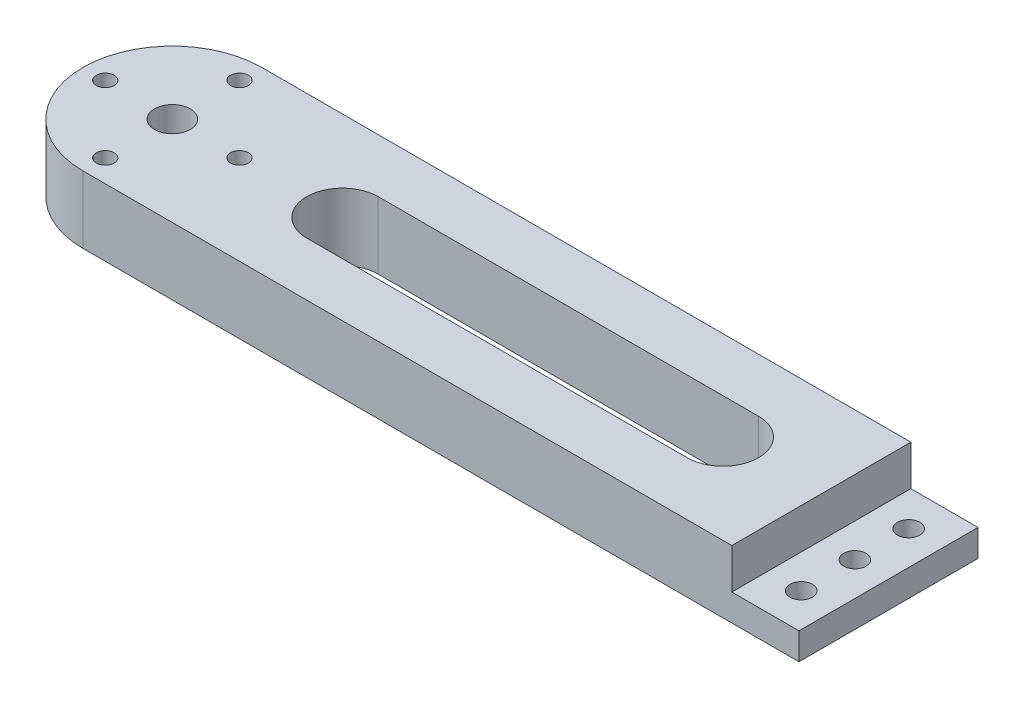
ISO-10303-21;
HEADER;
FILE_DESCRIPTION(('STEP AP214'),'2;1');
FILE_NAME('part.step','',(''),(''),'','','');
FILE_SCHEMA(('AUTOMOTIVE_DESIGN { 1 0 10303 214 1 1 1 1 }'));
ENDSEC;
DATA;
#1=APPLICATION_CONTEXT('core data for automotive mechanical design processes');
#2=APPLICATION_PROTOCOL_DEFINITION('international standard','automotive_design',2000,#1);
#3=PRODUCT_CONTEXT('',#1,'mechanical');
#4=PRODUCT('Part','Part','',(#3));
#5=PRODUCT_RELATED_PRODUCT_CATEGORY('part','',(#4));
#6=PRODUCT_DEFINITION_FORMATION('','',#4);
#7=PRODUCT_DEFINITION_CONTEXT('part definition',#1,'design');
#8=PRODUCT_DEFINITION('design','',#6,#7);
#9=PRODUCT_DEFINITION_SHAPE('','',#8);
#10=(LENGTH_UNIT() NAMED_UNIT(*) SI_UNIT(.MILLI.,.METRE.));
#11=(NAMED_UNIT(*) PLANE_ANGLE_UNIT() SI_UNIT($,.RADIAN.));
#12=(NAMED_UNIT(*) SI_UNIT($,.STERADIAN.) SOLID_ANGLE_UNIT());
#13=UNCERTAINTY_MEASURE_WITH_UNIT(LENGTH_MEASURE(1.E-05),#10,'distance_accuracy_value','');
#14=(GEOMETRIC_REPRESENTATION_CONTEXT(3) GLOBAL_UNCERTAINTY_ASSIGNED_CONTEXT((#13)) GLOBAL_UNIT_ASSIGNED_CONTEXT((#10,
#11,#12)) REPRESENTATION_CONTEXT('',''));
#15=CARTESIAN_POINT('',(0.,0.,0.));
#16=DIRECTION('',(0.,0.,1.));
#17=DIRECTION('',(1.,0.,0.));
#18=AXIS2_PLACEMENT_3D('',#15,#16,#17);
#19=CARTESIAN_POINT('',(0.,15.,0.));
#20=DIRECTION('',(0.,1.,0.));
#21=DIRECTION('',(0.,0.,1.));
#22=AXIS2_PLACEMENT_3D('',#19,#20,#21);
#23=PLANE('',#22);
#24=DIRECTION('',(0.,0.,1.));
#25=VECTOR('',#24,1.);
#26=CARTESIAN_POINT('',(145.,15.,-20.001));
#27=LINE('',#26,#25);
#28=CARTESIAN_POINT('',(145.,15.,-20.));
#29=VERTEX_POINT('',#28);
#30=CARTESIAN_POINT('',(145.,15.,20.));
#31=VERTEX_POINT('',#30);
#32=EDGE_CURVE('E171',#29,#31,#27,.T.);
#33=ORIENTED_EDGE('',*,*,#32,.F.);
#34=DIRECTION('',(-1.,0.,0.));
#35=VECTOR('',#34,1.);
#36=CARTESIAN_POINT('',(0.,15.,-20.));
#37=LINE('',#36,#35);
#38=CARTESIAN_POINT('',(0.,15.,-20.));
#39=VERTEX_POINT('',#38);
#40=EDGE_CURVE('E216',#29,#39,#37,.T.);
#41=ORIENTED_EDGE('',*,*,#40,.T.);
#42=CARTESIAN_POINT('',(0.,15.,0.));
#43=DIRECTION('',(0.,1.,0.));
#44=DIRECTION('',(0.,0.,1.));
#45=AXIS2_PLACEMENT_3D('',#42,#43,#44);
#46=CIRCLE('',#45,20.);
#47=CARTESIAN_POINT('',(0.,15.,20.));
#48=VERTEX_POINT('',#47);
#49=EDGE_CURVE('E209',#39,#48,#46,.T.);
#50=ORIENTED_EDGE('',*,*,#49,.T.);
#51=DIRECTION('',(1.,0.,0.));
#52=VECTOR('',#51,1.);
#53=CARTESIAN_POINT('',(0.,15.,20.));
#54=LINE('',#53,#52);
#55=EDGE_CURVE('E212',#48,#31,#54,.T.);
#56=ORIENTED_EDGE('',*,*,#55,.T.);
#57=EDGE_LOOP('',(#33,#41,#50,#56));
#58=FACE_BOUND('',#57,.T.);
#59=CARTESIAN_POINT('',(1.68570821703788E-12,15.,15.));
#60=DIRECTION('',(0.,1.,0.));
#61=DIRECTION('',(0.,0.,1.));
#62=AXIS2_PLACEMENT_3D('',#59,#60,#61);
#63=CIRCLE('',#62,2.);
#64=CARTESIAN_POINT('',(1.68570821703788E-12,15.,17.));
#65=VERTEX_POINT('',#64);
#66=EDGE_CURVE('E185',#65,#65,#63,.T.);
#67=ORIENTED_EDGE('',*,*,#66,.F.);
#68=EDGE_LOOP('',(#67));
#69=FACE_BOUND('',#68,.T.);
#70=CARTESIAN_POINT('',(0.,15.,-15.));
#71=DIRECTION('',(0.,1.,0.));
#72=DIRECTION('',(0.,0.,1.));
#73=AXIS2_PLACEMENT_3D('',#70,#71,#72);
#74=CIRCLE('',#73,2.);
#75=CARTESIAN_POINT('',(0.,15.,-13.));
#76=VERTEX_POINT('',#75);
#77=EDGE_CURVE('E197',#76,#76,#74,.T.);
#78=ORIENTED_EDGE('',*,*,#77,.F.);
#79=EDGE_LOOP('',(#78));
#80=FACE_BOUND('',#79,.T.);
#81=CARTESIAN_POINT('',(0.,15.,0.));
#82=DIRECTION('',(0.,1.,0.));
#83=DIRECTION('',(0.,0.,1.));
#84=AXIS2_PLACEMENT_3D('',#81,#82,#83);
#85=CIRCLE('',#84,4.);
#86=CARTESIAN_POINT('',(0.,15.,4.));
#87=VERTEX_POINT('',#86);
#88=EDGE_CURVE('E203',#87,#87,#85,.T.);
#89=ORIENTED_EDGE('',*,*,#88,.F.);
#90=EDGE_LOOP('',(#89));
#91=FACE_BOUND('',#90,.T.);
#92=CARTESIAN_POINT('',(15.0000000000008,15.,-8.46221887216597E-13));
#93=DIRECTION('',(0.,1.,0.));
#94=DIRECTION('',(0.,0.,1.));
#95=AXIS2_PLACEMENT_3D('',#92,#93,#94);
#96=CIRCLE('',#95,2.);
#97=CARTESIAN_POINT('',(15.0000000000008,15.,1.99999999999915));
#98=VERTEX_POINT('',#97);
#99=EDGE_CURVE('E191',#98,#98,#96,.T.);
#100=ORIENTED_EDGE('',*,*,#99,.F.);
#101=EDGE_LOOP('',(#100));
#102=FACE_BOUND('',#101,.T.);
#103=CARTESIAN_POINT('',(-14.9999999999992,15.,8.48058857415317E-13));
#104=DIRECTION('',(0.,1.,0.));
#105=DIRECTION('',(0.,0.,1.));
#106=AXIS2_PLACEMENT_3D('',#103,#104,#105);
#107=CIRCLE('',#106,2.);
#108=CARTESIAN_POINT('',(-14.9999999999992,15.,2.00000000000084));
#109=VERTEX_POINT('',#108);
#110=EDGE_CURVE('E179',#109,#109,#107,.T.);
#111=ORIENTED_EDGE('',*,*,#110,.F.);
#112=EDGE_LOOP('',(#111));
#113=FACE_BOUND('',#112,.T.);
#114=DIRECTION('',(-1.,0.,0.));
#115=VECTOR('',#114,1.);
#116=CARTESIAN_POINT('',(38.,15.,-7.99999999999998));
#117=LINE('',#116,#115);
#118=CARTESIAN_POINT('',(123.,15.,-8.00000000000002));
#119=VERTEX_POINT('',#118);
#120=CARTESIAN_POINT('',(38.,15.,-7.99999999999998));
#121=VERTEX_POINT('',#120);
#122=EDGE_CURVE('E128',#119,#121,#117,.T.);
#123=ORIENTED_EDGE('',*,*,#122,.F.);
#124=CARTESIAN_POINT('',(123.,15.,0.));
#125=DIRECTION('',(0.,1.,0.));
#126=DIRECTION('',(0.,0.,1.));
#127=AXIS2_PLACEMENT_3D('',#124,#125,#126);
#128=CIRCLE('',#127,8.);
#129=CARTESIAN_POINT('',(123.,15.,7.99999999999998));
#130=VERTEX_POINT('',#129);
#131=EDGE_CURVE('E112',#130,#119,#128,.T.);
#132=ORIENTED_EDGE('',*,*,#131,.F.);
#133=DIRECTION('',(1.,0.,0.));
#134=VECTOR('',#133,1.);
#135=CARTESIAN_POINT('',(38.,15.,7.99999999999998));
#136=LINE('',#135,#134);
#137=CARTESIAN_POINT('',(38.,15.,7.99999999999998));
#138=VERTEX_POINT('',#137);
#139=EDGE_CURVE('E121',#138,#130,#136,.T.);
#140=ORIENTED_EDGE('',*,*,#139,.F.);
#141=CARTESIAN_POINT('',(38.,15.,0.));
#142=DIRECTION('',(0.,1.,0.));
#143=DIRECTION('',(0.,0.,1.));
#144=AXIS2_PLACEMENT_3D('',#141,#142,#143);
#145=CIRCLE('',#144,7.99999999999998);
#146=EDGE_CURVE('E48',#121,#138,#145,.T.);
#147=ORIENTED_EDGE('',*,*,#146,.F.);
#148=EDGE_LOOP('',(#123,#132,#140,#147));
#149=FACE_BOUND('',#148,.T.);
#150=ADVANCED_FACE('F33',(#58,#69,#80,#91,#102,#113,#149),#23,.T.);
#151=CARTESIAN_POINT('',(0.,0.,0.));
#152=DIRECTION('',(0.,1.,0.));
#153=DIRECTION('',(0.,0.,1.));
#154=AXIS2_PLACEMENT_3D('',#151,#152,#153);
#155=PLANE('',#154);
#156=CARTESIAN_POINT('',(-14.9999999999992,0.,8.48058857415317E-13));
#157=DIRECTION('',(0.,1.,0.));
#158=DIRECTION('',(0.,0.,1.));
#159=AXIS2_PLACEMENT_3D('',#156,#157,#158);
#160=CIRCLE('',#159,2.);
#161=CARTESIAN_POINT('',(-14.9999999999992,0.,2.00000000000084));
#162=VERTEX_POINT('',#161);
#163=EDGE_CURVE('E175',#162,#162,#160,.T.);
#164=ORIENTED_EDGE('',*,*,#163,.T.);
#165=EDGE_LOOP('',(#164));
#166=FACE_BOUND('',#165,.T.);
#167=CARTESIAN_POINT('',(1.68570821703788E-12,0.,15.));
#168=DIRECTION('',(0.,1.,0.));
#169=DIRECTION('',(0.,0.,1.));
#170=AXIS2_PLACEMENT_3D('',#167,#168,#169);
#171=CIRCLE('',#170,2.);
#172=CARTESIAN_POINT('',(1.68570821703788E-12,0.,17.));
#173=VERTEX_POINT('',#172);
#174=EDGE_CURVE('E182',#173,#173,#171,.T.);
#175=ORIENTED_EDGE('',*,*,#174,.T.);
#176=EDGE_LOOP('',(#175));
#177=FACE_BOUND('',#176,.T.);
#178=CARTESIAN_POINT('',(15.0000000000008,0.,-8.46221887216597E-13));
#179=DIRECTION('',(0.,1.,0.));
#180=DIRECTION('',(0.,0.,1.));
#181=AXIS2_PLACEMENT_3D('',#178,#179,#180);
#182=CIRCLE('',#181,2.);
#183=CARTESIAN_POINT('',(15.0000000000008,0.,1.99999999999915));
#184=VERTEX_POINT('',#183);
#185=EDGE_CURVE('E188',#184,#184,#182,.T.);
#186=ORIENTED_EDGE('',*,*,#185,.T.);
#187=EDGE_LOOP('',(#186));
#188=FACE_BOUND('',#187,.T.);
#189=CARTESIAN_POINT('',(0.,0.,-15.));
#190=DIRECTION('',(0.,1.,0.));
#191=DIRECTION('',(0.,0.,1.));
#192=AXIS2_PLACEMENT_3D('',#189,#190,#191);
#193=CIRCLE('',#192,2.);
#194=CARTESIAN_POINT('',(0.,0.,-13.));
#195=VERTEX_POINT('',#194);
#196=EDGE_CURVE('E194',#195,#195,#193,.T.);
#197=ORIENTED_EDGE('',*,*,#196,.T.);
#198=EDGE_LOOP('',(#197));
#199=FACE_BOUND('',#198,.T.);
#200=CARTESIAN_POINT('',(0.,0.,0.));
#201=DIRECTION('',(0.,1.,0.));
#202=DIRECTION('',(0.,0.,1.));
#203=AXIS2_PLACEMENT_3D('',#200,#201,#202);
#204=CIRCLE('',#203,4.);
#205=CARTESIAN_POINT('',(0.,0.,4.));
#206=VERTEX_POINT('',#205);
#207=EDGE_CURVE('E200',#206,#206,#204,.T.);
#208=ORIENTED_EDGE('',*,*,#207,.T.);
#209=EDGE_LOOP('',(#208));
#210=FACE_BOUND('',#209,.T.);
#211=CARTESIAN_POINT('',(0.,0.,0.));
#212=DIRECTION('',(0.,1.,0.));
#213=DIRECTION('',(0.,0.,1.));
#214=AXIS2_PLACEMENT_3D('',#211,#212,#213);
#215=CIRCLE('',#214,20.);
#216=CARTESIAN_POINT('',(0.,0.,-20.));
#217=VERTEX_POINT('',#216);
#218=CARTESIAN_POINT('',(0.,0.,20.));
#219=VERTEX_POINT('',#218);
#220=EDGE_CURVE('E206',#217,#219,#215,.T.);
#221=ORIENTED_EDGE('',*,*,#220,.F.);
#222=DIRECTION('',(-1.,0.,0.));
#223=VECTOR('',#222,1.);
#224=CARTESIAN_POINT('',(0.,0.,-20.));
#225=LINE('',#224,#223);
#226=CARTESIAN_POINT('',(160.,0.,-20.));
#227=VERTEX_POINT('',#226);
#228=EDGE_CURVE('E213',#227,#217,#225,.T.);
#229=ORIENTED_EDGE('',*,*,#228,.F.);
#230=DIRECTION('',(0.,0.,-1.));
#231=VECTOR('',#230,1.);
#232=CARTESIAN_POINT('',(160.,0.,-20.));
#233=LINE('',#232,#231);
#234=CARTESIAN_POINT('',(160.,0.,20.));
#235=VERTEX_POINT('',#234);
#236=EDGE_CURVE('E224',#235,#227,#233,.T.);
#237=ORIENTED_EDGE('',*,*,#236,.F.);
#238=DIRECTION('',(1.,0.,0.));
#239=VECTOR('',#238,1.);
#240=CARTESIAN_POINT('',(0.,0.,20.));
#241=LINE('',#240,#239);
#242=EDGE_CURVE('E221',#219,#235,#241,.T.);
#243=ORIENTED_EDGE('',*,*,#242,.F.);
#244=EDGE_LOOP('',(#221,#229,#237,#243));
#245=FACE_BOUND('',#244,.T.);
#246=CARTESIAN_POINT('',(152.5,0.,-12.));
#247=DIRECTION('',(0.,-1.,0.));
#248=DIRECTION('',(0.,0.,-1.));
#249=AXIS2_PLACEMENT_3D('',#246,#247,#248);
#250=CIRCLE('',#249,2.5);
#251=CARTESIAN_POINT('',(152.5,0.,-14.5));
#252=VERTEX_POINT('',#251);
#253=EDGE_CURVE('E156',#252,#252,#250,.T.);
#254=ORIENTED_EDGE('',*,*,#253,.F.);
#255=EDGE_LOOP('',(#254));
#256=FACE_BOUND('',#255,.T.);
#257=CARTESIAN_POINT('',(152.5,0.,0.));
#258=DIRECTION('',(0.,-1.,0.));
#259=DIRECTION('',(0.,0.,-1.));
#260=AXIS2_PLACEMENT_3D('',#257,#258,#259);
#261=CIRCLE('',#260,2.5);
#262=CARTESIAN_POINT('',(152.5,0.,-2.5));
#263=VERTEX_POINT('',#262);
#264=EDGE_CURVE('E150',#263,#263,#261,.T.);
#265=ORIENTED_EDGE('',*,*,#264,.F.);
#266=EDGE_LOOP('',(#265));
#267=FACE_BOUND('',#266,.T.);
#268=CARTESIAN_POINT('',(152.5,0.,12.));
#269=DIRECTION('',(0.,-1.,0.));
#270=DIRECTION('',(0.,0.,-1.));
#271=AXIS2_PLACEMENT_3D('',#268,#269,#270);
#272=CIRCLE('',#271,2.5);
#273=CARTESIAN_POINT('',(152.5,0.,9.5));
#274=VERTEX_POINT('',#273);
#275=EDGE_CURVE('E124',#274,#274,#272,.T.);
#276=ORIENTED_EDGE('',*,*,#275,.F.);
#277=EDGE_LOOP('',(#276));
#278=FACE_BOUND('',#277,.T.);
#279=CARTESIAN_POINT('',(123.,0.,0.));
#280=DIRECTION('',(0.,1.,0.));
#281=DIRECTION('',(0.,0.,-1.));
#282=AXIS2_PLACEMENT_3D('',#279,#280,#281);
#283=CIRCLE('',#282,8.);
#284=CARTESIAN_POINT('',(123.,0.,7.99999999999998));
#285=VERTEX_POINT('',#284);
#286=CARTESIAN_POINT('',(123.,0.,-8.00000000000002));
#287=VERTEX_POINT('',#286);
#288=EDGE_CURVE('E56',#285,#287,#283,.T.);
#289=ORIENTED_EDGE('',*,*,#288,.T.);
#290=DIRECTION('',(-1.,0.,0.));
#291=VECTOR('',#290,1.);
#292=CARTESIAN_POINT('',(38.,0.,-7.99999999999998));
#293=LINE('',#292,#291);
#294=CARTESIAN_POINT('',(38.,0.,-7.99999999999998));
#295=VERTEX_POINT('',#294);
#296=EDGE_CURVE('E130',#287,#295,#293,.T.);
#297=ORIENTED_EDGE('',*,*,#296,.T.);
#298=CARTESIAN_POINT('',(38.,0.,0.));
#299=DIRECTION('',(0.,1.,0.));
#300=DIRECTION('',(0.,0.,1.));
#301=AXIS2_PLACEMENT_3D('',#298,#299,#300);
#302=CIRCLE('',#301,7.99999999999998);
#303=CARTESIAN_POINT('',(38.,0.,7.99999999999998));
#304=VERTEX_POINT('',#303);
#305=EDGE_CURVE('E137',#295,#304,#302,.T.);
#306=ORIENTED_EDGE('',*,*,#305,.T.);
#307=DIRECTION('',(1.,0.,0.));
#308=VECTOR('',#307,1.);
#309=CARTESIAN_POINT('',(38.,0.,7.99999999999998));
#310=LINE('',#309,#308);
#311=EDGE_CURVE('E118',#304,#285,#310,.T.);
#312=ORIENTED_EDGE('',*,*,#311,.T.);
#313=EDGE_LOOP('',(#289,#297,#306,#312));
#314=FACE_BOUND('',#313,.T.);
#315=ADVANCED_FACE('F243',(#166,#177,#188,#199,#210,#245,#256,#267,#278,#314),#155,.F.);
#316=CARTESIAN_POINT('',(0.,15.,0.));
#317=DIRECTION('',(0.,-1.,0.));
#318=DIRECTION('',(0.,0.,-1.));
#319=AXIS2_PLACEMENT_3D('',#316,#317,#318);
#320=CYLINDRICAL_SURFACE('',#319,20.);
#321=ORIENTED_EDGE('',*,*,#220,.T.);
#322=DIRECTION('',(0.,-1.,0.));
#323=VECTOR('',#322,1.);
#324=CARTESIAN_POINT('',(0.,15.,20.));
#325=LINE('',#324,#323);
#326=EDGE_CURVE('E11',#48,#219,#325,.T.);
#327=ORIENTED_EDGE('',*,*,#326,.F.);
#328=ORIENTED_EDGE('',*,*,#49,.F.);
#329=DIRECTION('',(0.,-1.,0.));
#330=VECTOR('',#329,1.);
#331=CARTESIAN_POINT('',(0.,15.,-20.));
#332=LINE('',#331,#330);
#333=EDGE_CURVE('E218',#39,#217,#332,.T.);
#334=ORIENTED_EDGE('',*,*,#333,.T.);
#335=EDGE_LOOP('',(#321,#327,#328,#334));
#336=FACE_BOUND('',#335,.T.);
#337=ADVANCED_FACE('F35',(#336),#320,.T.);
#338=CARTESIAN_POINT('',(0.,15.,20.));
#339=DIRECTION('',(0.,0.,-1.));
#340=DIRECTION('',(-1.,0.,0.));
#341=AXIS2_PLACEMENT_3D('',#338,#339,#340);
#342=PLANE('',#341);
#343=DIRECTION('',(0.,-1.,0.));
#344=VECTOR('',#343,1.);
#345=CARTESIAN_POINT('',(160.,15.,20.));
#346=LINE('',#345,#344);
#347=CARTESIAN_POINT('',(160.,6.,20.));
#348=VERTEX_POINT('',#347);
#349=EDGE_CURVE('E41',#348,#235,#346,.T.);
#350=ORIENTED_EDGE('',*,*,#349,.F.);
#351=DIRECTION('',(1.,0.,0.));
#352=VECTOR('',#351,1.);
#353=CARTESIAN_POINT('',(160.,6.,20.));
#354=LINE('',#353,#352);
#355=CARTESIAN_POINT('',(145.,6.,20.));
#356=VERTEX_POINT('',#355);
#357=EDGE_CURVE('E169',#356,#348,#354,.T.);
#358=ORIENTED_EDGE('',*,*,#357,.F.);
#359=DIRECTION('',(0.,-1.,0.));
#360=VECTOR('',#359,1.);
#361=CARTESIAN_POINT('',(145.,15.,20.));
#362=LINE('',#361,#360);
#363=EDGE_CURVE('E166',#31,#356,#362,.T.);
#364=ORIENTED_EDGE('',*,*,#363,.F.);
#365=ORIENTED_EDGE('',*,*,#55,.F.);
#366=ORIENTED_EDGE('',*,*,#326,.T.);
#367=ORIENTED_EDGE('',*,*,#242,.T.);
#368=EDGE_LOOP('',(#350,#358,#364,#365,#366,#367));
#369=FACE_BOUND('',#368,.T.);
#370=ADVANCED_FACE('F239',(#369),#342,.F.);
#371=CARTESIAN_POINT('',(160.,15.,-20.));
#372=DIRECTION('',(-1.,0.,0.));
#373=DIRECTION('',(0.,0.,1.));
#374=AXIS2_PLACEMENT_3D('',#371,#372,#373);
#375=PLANE('',#374);
#376=DIRECTION('',(0.,-1.,0.));
#377=VECTOR('',#376,1.);
#378=CARTESIAN_POINT('',(160.,15.,-20.));
#379=LINE('',#378,#377);
#380=CARTESIAN_POINT('',(160.,6.,-20.));
#381=VERTEX_POINT('',#380);
#382=EDGE_CURVE('E230',#381,#227,#379,.T.);
#383=ORIENTED_EDGE('',*,*,#382,.F.);
#384=DIRECTION('',(0.,0.,1.));
#385=VECTOR('',#384,1.);
#386=CARTESIAN_POINT('',(160.,6.,-20.001));
#387=LINE('',#386,#385);
#388=EDGE_CURVE('E172',#381,#348,#387,.T.);
#389=ORIENTED_EDGE('',*,*,#388,.T.);
#390=ORIENTED_EDGE('',*,*,#349,.T.);
#391=ORIENTED_EDGE('',*,*,#236,.T.);
#392=EDGE_LOOP('',(#383,#389,#390,#391));
#393=FACE_BOUND('',#392,.T.);
#394=ADVANCED_FACE('F234',(#393),#375,.F.);
#395=CARTESIAN_POINT('',(0.,15.,-20.));
#396=DIRECTION('',(0.,0.,1.));
#397=DIRECTION('',(1.,0.,0.));
#398=AXIS2_PLACEMENT_3D('',#395,#396,#397);
#399=PLANE('',#398);
#400=DIRECTION('',(0.,1.,0.));
#401=VECTOR('',#400,1.);
#402=CARTESIAN_POINT('',(145.,15.,-20.));
#403=LINE('',#402,#401);
#404=CARTESIAN_POINT('',(145.,6.,-20.));
#405=VERTEX_POINT('',#404);
#406=EDGE_CURVE('E162',#405,#29,#403,.T.);
#407=ORIENTED_EDGE('',*,*,#406,.F.);
#408=DIRECTION('',(-1.,0.,0.));
#409=VECTOR('',#408,1.);
#410=CARTESIAN_POINT('',(160.,6.,-20.));
#411=LINE('',#410,#409);
#412=EDGE_CURVE('E164',#381,#405,#411,.T.);
#413=ORIENTED_EDGE('',*,*,#412,.F.);
#414=ORIENTED_EDGE('',*,*,#382,.T.);
#415=ORIENTED_EDGE('',*,*,#228,.T.);
#416=ORIENTED_EDGE('',*,*,#333,.F.);
#417=ORIENTED_EDGE('',*,*,#40,.F.);
#418=EDGE_LOOP('',(#407,#413,#414,#415,#416,#417));
#419=FACE_BOUND('',#418,.T.);
#420=ADVANCED_FACE('F248',(#419),#399,.F.);
#421=CARTESIAN_POINT('',(0.,15.,0.));
#422=DIRECTION('',(0.,-1.,0.));
#423=DIRECTION('',(0.,0.,-1.));
#424=AXIS2_PLACEMENT_3D('',#421,#422,#423);
#425=CYLINDRICAL_SURFACE('',#424,4.);
#426=ORIENTED_EDGE('',*,*,#88,.T.);
#427=EDGE_LOOP('',(#426));
#428=FACE_BOUND('',#427,.T.);
#429=ORIENTED_EDGE('',*,*,#207,.F.);
#430=EDGE_LOOP('',(#429));
#431=FACE_BOUND('',#430,.T.);
#432=ADVANCED_FACE('F286',(#428,#431),#425,.F.);
#433=CARTESIAN_POINT('',(0.,15.,-15.));
#434=DIRECTION('',(0.,-1.,0.));
#435=DIRECTION('',(0.,0.,-1.));
#436=AXIS2_PLACEMENT_3D('',#433,#434,#435);
#437=CYLINDRICAL_SURFACE('',#436,2.);
#438=ORIENTED_EDGE('',*,*,#77,.T.);
#439=EDGE_LOOP('',(#438));
#440=FACE_BOUND('',#439,.T.);
#441=ORIENTED_EDGE('',*,*,#196,.F.);
#442=EDGE_LOOP('',(#441));
#443=FACE_BOUND('',#442,.T.);
#444=ADVANCED_FACE('F323',(#440,#443),#437,.F.);
#445=CARTESIAN_POINT('',(15.0000000000008,15.,-8.46221887216597E-13));
#446=DIRECTION('',(0.,-1.,0.));
#447=DIRECTION('',(0.,0.,-1.));
#448=AXIS2_PLACEMENT_3D('',#445,#446,#447);
#449=CYLINDRICAL_SURFACE('',#448,2.);
#450=ORIENTED_EDGE('',*,*,#99,.T.);
#451=EDGE_LOOP('',(#450));
#452=FACE_BOUND('',#451,.T.);
#453=ORIENTED_EDGE('',*,*,#185,.F.);
#454=EDGE_LOOP('',(#453));
#455=FACE_BOUND('',#454,.T.);
#456=ADVANCED_FACE('F329',(#452,#455),#449,.F.);
#457=CARTESIAN_POINT('',(1.68570821703788E-12,15.,15.));
#458=DIRECTION('',(0.,-1.,0.));
#459=DIRECTION('',(0.,0.,-1.));
#460=AXIS2_PLACEMENT_3D('',#457,#458,#459);
#461=CYLINDRICAL_SURFACE('',#460,2.);
#462=ORIENTED_EDGE('',*,*,#66,.T.);
#463=EDGE_LOOP('',(#462));
#464=FACE_BOUND('',#463,.T.);
#465=ORIENTED_EDGE('',*,*,#174,.F.);
#466=EDGE_LOOP('',(#465));
#467=FACE_BOUND('',#466,.T.);
#468=ADVANCED_FACE('F272',(#464,#467),#461,.F.);
#469=CARTESIAN_POINT('',(-14.9999999999992,15.,8.48058857415317E-13));
#470=DIRECTION('',(0.,-1.,0.));
#471=DIRECTION('',(0.,0.,-1.));
#472=AXIS2_PLACEMENT_3D('',#469,#470,#471);
#473=CYLINDRICAL_SURFACE('',#472,2.);
#474=ORIENTED_EDGE('',*,*,#110,.T.);
#475=EDGE_LOOP('',(#474));
#476=FACE_BOUND('',#475,.T.);
#477=ORIENTED_EDGE('',*,*,#163,.F.);
#478=EDGE_LOOP('',(#477));
#479=FACE_BOUND('',#478,.T.);
#480=ADVANCED_FACE('F263',(#476,#479),#473,.F.);
#481=CARTESIAN_POINT('',(160.,6.,-20.001));
#482=DIRECTION('',(0.,-1.,0.));
#483=DIRECTION('',(1.,0.,0.));
#484=AXIS2_PLACEMENT_3D('',#481,#482,#483);
#485=PLANE('',#484);
#486=CARTESIAN_POINT('',(152.5,6.,12.));
#487=DIRECTION('',(0.,-1.,0.));
#488=DIRECTION('',(1.,0.,0.));
#489=AXIS2_PLACEMENT_3D('',#486,#487,#488);
#490=CIRCLE('',#489,2.5);
#491=CARTESIAN_POINT('',(155.,6.,12.));
#492=VERTEX_POINT('',#491);
#493=EDGE_CURVE('E147',#492,#492,#490,.T.);
#494=ORIENTED_EDGE('',*,*,#493,.T.);
#495=EDGE_LOOP('',(#494));
#496=FACE_BOUND('',#495,.T.);
#497=CARTESIAN_POINT('',(152.5,6.,0.));
#498=DIRECTION('',(0.,-1.,0.));
#499=DIRECTION('',(1.,0.,0.));
#500=AXIS2_PLACEMENT_3D('',#497,#498,#499);
#501=CIRCLE('',#500,2.5);
#502=CARTESIAN_POINT('',(155.,6.,0.));
#503=VERTEX_POINT('',#502);
#504=EDGE_CURVE('E153',#503,#503,#501,.T.);
#505=ORIENTED_EDGE('',*,*,#504,.T.);
#506=EDGE_LOOP('',(#505));
#507=FACE_BOUND('',#506,.T.);
#508=CARTESIAN_POINT('',(152.5,6.,-12.));
#509=DIRECTION('',(0.,-1.,0.));
#510=DIRECTION('',(1.,0.,0.));
#511=AXIS2_PLACEMENT_3D('',#508,#509,#510);
#512=CIRCLE('',#511,2.5);
#513=CARTESIAN_POINT('',(155.,6.,-12.));
#514=VERTEX_POINT('',#513);
#515=EDGE_CURVE('E159',#514,#514,#512,.T.);
#516=ORIENTED_EDGE('',*,*,#515,.T.);
#517=EDGE_LOOP('',(#516));
#518=FACE_BOUND('',#517,.T.);
#519=ORIENTED_EDGE('',*,*,#412,.T.);
#520=DIRECTION('',(0.,0.,1.));
#521=VECTOR('',#520,1.);
#522=CARTESIAN_POINT('',(145.,6.,-20.001));
#523=LINE('',#522,#521);
#524=EDGE_CURVE('E176',#405,#356,#523,.T.);
#525=ORIENTED_EDGE('',*,*,#524,.T.);
#526=ORIENTED_EDGE('',*,*,#357,.T.);
#527=ORIENTED_EDGE('',*,*,#388,.F.);
#528=EDGE_LOOP('',(#519,#525,#526,#527));
#529=FACE_BOUND('',#528,.T.);
#530=ADVANCED_FACE('F261',(#496,#507,#518,#529),#485,.F.);
#531=CARTESIAN_POINT('',(145.,15.,-20.001));
#532=DIRECTION('',(-1.,0.,0.));
#533=DIRECTION('',(0.,-1.,0.));
#534=AXIS2_PLACEMENT_3D('',#531,#532,#533);
#535=PLANE('',#534);
#536=ORIENTED_EDGE('',*,*,#406,.T.);
#537=ORIENTED_EDGE('',*,*,#32,.T.);
#538=ORIENTED_EDGE('',*,*,#363,.T.);
#539=ORIENTED_EDGE('',*,*,#524,.F.);
#540=EDGE_LOOP('',(#536,#537,#538,#539));
#541=FACE_BOUND('',#540,.T.);
#542=ADVANCED_FACE('F258',(#541),#535,.F.);
#543=CARTESIAN_POINT('',(152.5,0.,-12.));
#544=DIRECTION('',(0.,-1.,0.));
#545=DIRECTION('',(0.,0.,-1.));
#546=AXIS2_PLACEMENT_3D('',#543,#544,#545);
#547=CYLINDRICAL_SURFACE('',#546,2.5);
#548=ORIENTED_EDGE('',*,*,#253,.T.);
#549=EDGE_LOOP('',(#548));
#550=FACE_BOUND('',#549,.T.);
#551=ORIENTED_EDGE('',*,*,#515,.F.);
#552=EDGE_LOOP('',(#551));
#553=FACE_BOUND('',#552,.T.);
#554=ADVANCED_FACE('F270',(#550,#553),#547,.F.);
#555=CARTESIAN_POINT('',(152.5,0.,0.));
#556=DIRECTION('',(0.,-1.,0.));
#557=DIRECTION('',(0.,0.,-1.));
#558=AXIS2_PLACEMENT_3D('',#555,#556,#557);
#559=CYLINDRICAL_SURFACE('',#558,2.5);
#560=ORIENTED_EDGE('',*,*,#264,.T.);
#561=EDGE_LOOP('',(#560));
#562=FACE_BOUND('',#561,.T.);
#563=ORIENTED_EDGE('',*,*,#504,.F.);
#564=EDGE_LOOP('',(#563));
#565=FACE_BOUND('',#564,.T.);
#566=ADVANCED_FACE('F367',(#562,#565),#559,.F.);
#567=CARTESIAN_POINT('',(152.5,0.,12.));
#568=DIRECTION('',(0.,-1.,0.));
#569=DIRECTION('',(0.,0.,-1.));
#570=AXIS2_PLACEMENT_3D('',#567,#568,#569);
#571=CYLINDRICAL_SURFACE('',#570,2.5);
#572=ORIENTED_EDGE('',*,*,#275,.T.);
#573=EDGE_LOOP('',(#572));
#574=FACE_BOUND('',#573,.T.);
#575=ORIENTED_EDGE('',*,*,#493,.F.);
#576=EDGE_LOOP('',(#575));
#577=FACE_BOUND('',#576,.T.);
#578=ADVANCED_FACE('F375',(#574,#577),#571,.F.);
#579=CARTESIAN_POINT('',(123.,15.001,0.));
#580=DIRECTION('',(0.,-1.,0.));
#581=DIRECTION('',(0.,0.,-1.));
#582=AXIS2_PLACEMENT_3D('',#579,#580,#581);
#583=CYLINDRICAL_SURFACE('',#582,8.);
#584=ORIENTED_EDGE('',*,*,#131,.T.);
#585=DIRECTION('',(0.,-1.,0.));
#586=VECTOR('',#585,1.);
#587=CARTESIAN_POINT('',(123.,15.001,-8.00000000000002));
#588=LINE('',#587,#586);
#589=EDGE_CURVE('E125',#119,#287,#588,.T.);
#590=ORIENTED_EDGE('',*,*,#589,.T.);
#591=ORIENTED_EDGE('',*,*,#288,.F.);
#592=DIRECTION('',(0.,-1.,0.));
#593=VECTOR('',#592,1.);
#594=CARTESIAN_POINT('',(123.,15.001,7.99999999999998));
#595=LINE('',#594,#593);
#596=EDGE_CURVE('E108',#130,#285,#595,.T.);
#597=ORIENTED_EDGE('',*,*,#596,.F.);
#598=EDGE_LOOP('',(#584,#590,#591,#597));
#599=FACE_BOUND('',#598,.T.);
#600=ADVANCED_FACE('F110',(#599),#583,.F.);
#601=CARTESIAN_POINT('',(38.,15.001,-7.99999999999998));
#602=DIRECTION('',(0.,0.,1.));
#603=DIRECTION('',(1.,0.,0.));
#604=AXIS2_PLACEMENT_3D('',#601,#602,#603);
#605=PLANE('',#604);
#606=ORIENTED_EDGE('',*,*,#122,.T.);
#607=DIRECTION('',(0.,-1.,0.));
#608=VECTOR('',#607,1.);
#609=CARTESIAN_POINT('',(38.,15.001,-7.99999999999998));
#610=LINE('',#609,#608);
#611=EDGE_CURVE('E142',#121,#295,#610,.T.);
#612=ORIENTED_EDGE('',*,*,#611,.T.);
#613=ORIENTED_EDGE('',*,*,#296,.F.);
#614=ORIENTED_EDGE('',*,*,#589,.F.);
#615=EDGE_LOOP('',(#606,#612,#613,#614));
#616=FACE_BOUND('',#615,.T.);
#617=ADVANCED_FACE('F401',(#616),#605,.T.);
#618=CARTESIAN_POINT('',(38.,15.001,0.));
#619=DIRECTION('',(0.,-1.,0.));
#620=DIRECTION('',(0.,0.,-1.));
#621=AXIS2_PLACEMENT_3D('',#618,#619,#620);
#622=CYLINDRICAL_SURFACE('',#621,7.99999999999998);
#623=ORIENTED_EDGE('',*,*,#146,.T.);
#624=DIRECTION('',(0.,-1.,0.));
#625=VECTOR('',#624,1.);
#626=CARTESIAN_POINT('',(38.,15.001,7.99999999999998));
#627=LINE('',#626,#625);
#628=EDGE_CURVE('E117',#138,#304,#627,.T.);
#629=ORIENTED_EDGE('',*,*,#628,.T.);
#630=ORIENTED_EDGE('',*,*,#305,.F.);
#631=ORIENTED_EDGE('',*,*,#611,.F.);
#632=EDGE_LOOP('',(#623,#629,#630,#631));
#633=FACE_BOUND('',#632,.T.);
#634=ADVANCED_FACE('F409',(#633),#622,.F.);
#635=CARTESIAN_POINT('',(38.,15.001,7.99999999999998));
#636=DIRECTION('',(0.,0.,-1.));
#637=DIRECTION('',(-1.,0.,0.));
#638=AXIS2_PLACEMENT_3D('',#635,#636,#637);
#639=PLANE('',#638);
#640=ORIENTED_EDGE('',*,*,#139,.T.);
#641=ORIENTED_EDGE('',*,*,#596,.T.);
#642=ORIENTED_EDGE('',*,*,#311,.F.);
#643=ORIENTED_EDGE('',*,*,#628,.F.);
#644=EDGE_LOOP('',(#640,#641,#642,#643));
#645=FACE_BOUND('',#644,.T.);
#646=ADVANCED_FACE('F122',(#645),#639,.T.);
#647=CLOSED_SHELL('',(#150,#315,#337,#370,#394,#420,#432,#444,#456,#468,#480,#530,#542,#554,
#566,#578,#600,#617,#634,#646));
#648=MANIFOLD_SOLID_BREP('B2',#647);
#649=ADVANCED_BREP_SHAPE_REPRESENTATION('',(#18,#648),#14);
#650=SHAPE_DEFINITION_REPRESENTATION(#9,#649);
ENDSEC;
END-ISO-10303-21;
